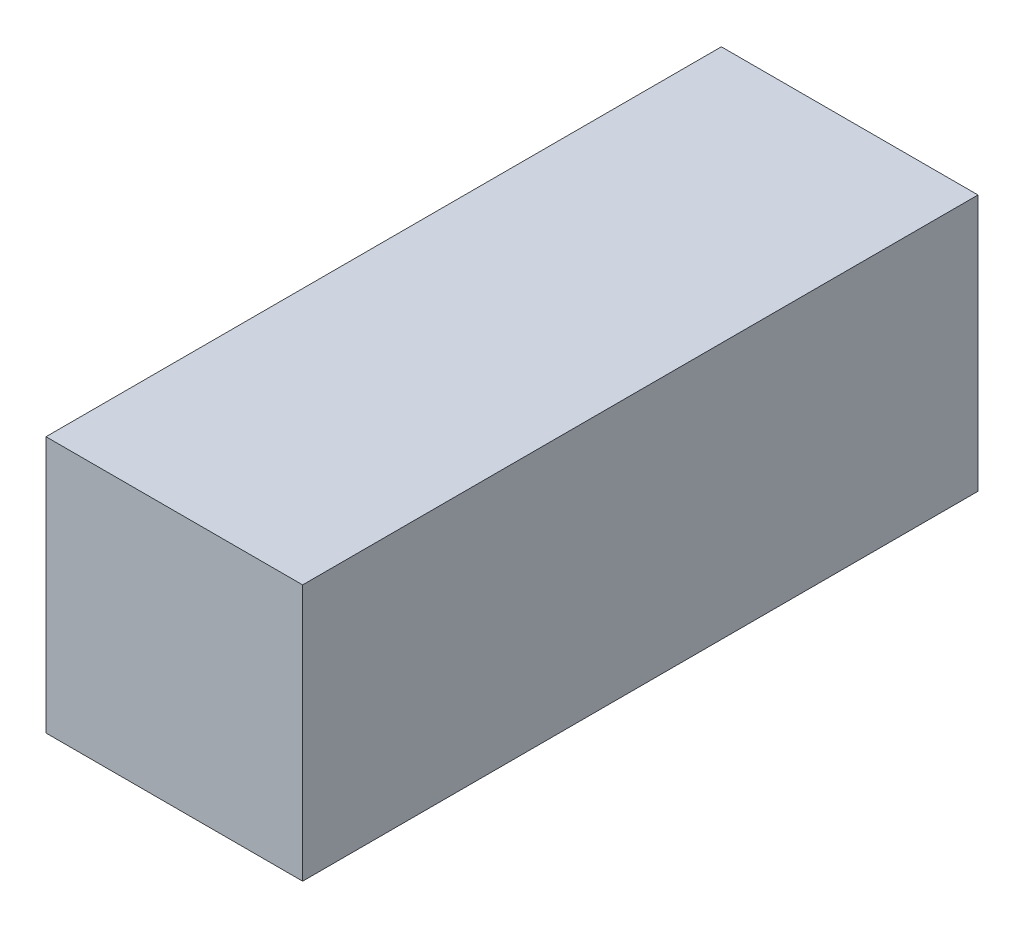
ISO-10303-21;
HEADER;
FILE_DESCRIPTION(('STEP AP214'),'2;1');
FILE_NAME('part.step','',(''),(''),'','','');
FILE_SCHEMA(('AUTOMOTIVE_DESIGN { 1 0 10303 214 1 1 1 1 }'));
ENDSEC;
DATA;
#1=APPLICATION_CONTEXT('core data for automotive mechanical design processes');
#2=APPLICATION_PROTOCOL_DEFINITION('international standard','automotive_design',2000,#1);
#3=PRODUCT_CONTEXT('',#1,'mechanical');
#4=PRODUCT('Part','Part','',(#3));
#5=PRODUCT_RELATED_PRODUCT_CATEGORY('part','',(#4));
#6=PRODUCT_DEFINITION_FORMATION('','',#4);
#7=PRODUCT_DEFINITION_CONTEXT('part definition',#1,'design');
#8=PRODUCT_DEFINITION('design','',#6,#7);
#9=PRODUCT_DEFINITION_SHAPE('','',#8);
#10=(LENGTH_UNIT() NAMED_UNIT(*) SI_UNIT(.MILLI.,.METRE.));
#11=(NAMED_UNIT(*) PLANE_ANGLE_UNIT() SI_UNIT($,.RADIAN.));
#12=(NAMED_UNIT(*) SI_UNIT($,.STERADIAN.) SOLID_ANGLE_UNIT());
#13=UNCERTAINTY_MEASURE_WITH_UNIT(LENGTH_MEASURE(1.E-05),#10,'distance_accuracy_value','');
#14=(GEOMETRIC_REPRESENTATION_CONTEXT(3) GLOBAL_UNCERTAINTY_ASSIGNED_CONTEXT((#13)) GLOBAL_UNIT_ASSIGNED_CONTEXT((#10,
#11,#12)) REPRESENTATION_CONTEXT('',''));
#15=CARTESIAN_POINT('',(0.,0.,0.));
#16=DIRECTION('',(0.,0.,1.));
#17=DIRECTION('',(1.,0.,0.));
#18=AXIS2_PLACEMENT_3D('',#15,#16,#17);
#19=CARTESIAN_POINT('',(-19.,19.,100.));
#20=DIRECTION('',(1.,0.,0.));
#21=DIRECTION('',(0.,0.,-1.));
#22=AXIS2_PLACEMENT_3D('',#19,#20,#21);
#23=PLANE('',#22);
#24=DIRECTION('',(0.,-1.,0.));
#25=VECTOR('',#24,1.);
#26=CARTESIAN_POINT('',(-19.,19.,0.));
#27=LINE('',#26,#25);
#28=CARTESIAN_POINT('',(-19.,19.,0.));
#29=VERTEX_POINT('',#28);
#30=CARTESIAN_POINT('',(-19.,-19.,0.));
#31=VERTEX_POINT('',#30);
#32=EDGE_CURVE('E96',#29,#31,#27,.T.);
#33=ORIENTED_EDGE('',*,*,#32,.T.);
#34=DIRECTION('',(0.,0.,-1.));
#35=VECTOR('',#34,1.);
#36=CARTESIAN_POINT('',(-19.,-19.,100.));
#37=LINE('',#36,#35);
#38=CARTESIAN_POINT('',(-19.,-19.,100.));
#39=VERTEX_POINT('',#38);
#40=EDGE_CURVE('E11',#39,#31,#37,.T.);
#41=ORIENTED_EDGE('',*,*,#40,.F.);
#42=DIRECTION('',(0.,-1.,0.));
#43=VECTOR('',#42,1.);
#44=CARTESIAN_POINT('',(-19.,19.,100.));
#45=LINE('',#44,#43);
#46=CARTESIAN_POINT('',(-19.,19.,100.));
#47=VERTEX_POINT('',#46);
#48=EDGE_CURVE('E84',#47,#39,#45,.T.);
#49=ORIENTED_EDGE('',*,*,#48,.F.);
#50=DIRECTION('',(0.,0.,-1.));
#51=VECTOR('',#50,1.);
#52=CARTESIAN_POINT('',(-19.,19.,100.));
#53=LINE('',#52,#51);
#54=EDGE_CURVE('E92',#47,#29,#53,.T.);
#55=ORIENTED_EDGE('',*,*,#54,.T.);
#56=EDGE_LOOP('',(#33,#41,#49,#55));
#57=FACE_BOUND('',#56,.T.);
#58=ADVANCED_FACE('F33',(#57),#23,.F.);
#59=CARTESIAN_POINT('',(19.,-19.,100.));
#60=DIRECTION('',(0.,1.,0.));
#61=DIRECTION('',(-1.,0.,0.));
#62=AXIS2_PLACEMENT_3D('',#59,#60,#61);
#63=PLANE('',#62);
#64=DIRECTION('',(1.,0.,0.));
#65=VECTOR('',#64,1.);
#66=CARTESIAN_POINT('',(19.,-19.,0.));
#67=LINE('',#66,#65);
#68=CARTESIAN_POINT('',(19.,-19.,0.));
#69=VERTEX_POINT('',#68);
#70=EDGE_CURVE('E88',#31,#69,#67,.T.);
#71=ORIENTED_EDGE('',*,*,#70,.T.);
#72=DIRECTION('',(0.,0.,-1.));
#73=VECTOR('',#72,1.);
#74=CARTESIAN_POINT('',(19.,-19.,100.));
#75=LINE('',#74,#73);
#76=CARTESIAN_POINT('',(19.,-19.,100.));
#77=VERTEX_POINT('',#76);
#78=EDGE_CURVE('E41',#77,#69,#75,.T.);
#79=ORIENTED_EDGE('',*,*,#78,.F.);
#80=DIRECTION('',(1.,0.,0.));
#81=VECTOR('',#80,1.);
#82=CARTESIAN_POINT('',(19.,-19.,100.));
#83=LINE('',#82,#81);
#84=EDGE_CURVE('E79',#39,#77,#83,.T.);
#85=ORIENTED_EDGE('',*,*,#84,.F.);
#86=ORIENTED_EDGE('',*,*,#40,.T.);
#87=EDGE_LOOP('',(#71,#79,#85,#86));
#88=FACE_BOUND('',#87,.T.);
#89=ADVANCED_FACE('F87',(#88),#63,.F.);
#90=CARTESIAN_POINT('',(19.,19.,100.));
#91=DIRECTION('',(-1.,0.,0.));
#92=DIRECTION('',(0.,0.,1.));
#93=AXIS2_PLACEMENT_3D('',#90,#91,#92);
#94=PLANE('',#93);
#95=DIRECTION('',(0.,1.,0.));
#96=VECTOR('',#95,1.);
#97=CARTESIAN_POINT('',(19.,19.,0.));
#98=LINE('',#97,#96);
#99=CARTESIAN_POINT('',(19.,19.,0.));
#100=VERTEX_POINT('',#99);
#101=EDGE_CURVE('E66',#69,#100,#98,.T.);
#102=ORIENTED_EDGE('',*,*,#101,.T.);
#103=DIRECTION('',(0.,0.,-1.));
#104=VECTOR('',#103,1.);
#105=CARTESIAN_POINT('',(19.,19.,100.));
#106=LINE('',#105,#104);
#107=CARTESIAN_POINT('',(19.,19.,100.));
#108=VERTEX_POINT('',#107);
#109=EDGE_CURVE('E89',#108,#100,#106,.T.);
#110=ORIENTED_EDGE('',*,*,#109,.F.);
#111=DIRECTION('',(0.,1.,0.));
#112=VECTOR('',#111,1.);
#113=CARTESIAN_POINT('',(19.,19.,100.));
#114=LINE('',#113,#112);
#115=EDGE_CURVE('E82',#77,#108,#114,.T.);
#116=ORIENTED_EDGE('',*,*,#115,.F.);
#117=ORIENTED_EDGE('',*,*,#78,.T.);
#118=EDGE_LOOP('',(#102,#110,#116,#117));
#119=FACE_BOUND('',#118,.T.);
#120=ADVANCED_FACE('F90',(#119),#94,.F.);
#121=CARTESIAN_POINT('',(19.,19.,100.));
#122=DIRECTION('',(0.,-1.,0.));
#123=DIRECTION('',(1.,0.,0.));
#124=AXIS2_PLACEMENT_3D('',#121,#122,#123);
#125=PLANE('',#124);
#126=DIRECTION('',(-1.,0.,0.));
#127=VECTOR('',#126,1.);
#128=CARTESIAN_POINT('',(19.,19.,0.));
#129=LINE('',#128,#127);
#130=EDGE_CURVE('E72',#100,#29,#129,.T.);
#131=ORIENTED_EDGE('',*,*,#130,.T.);
#132=ORIENTED_EDGE('',*,*,#54,.F.);
#133=DIRECTION('',(-1.,0.,0.));
#134=VECTOR('',#133,1.);
#135=CARTESIAN_POINT('',(19.,19.,100.));
#136=LINE('',#135,#134);
#137=EDGE_CURVE('E49',#108,#47,#136,.T.);
#138=ORIENTED_EDGE('',*,*,#137,.F.);
#139=ORIENTED_EDGE('',*,*,#109,.T.);
#140=EDGE_LOOP('',(#131,#132,#138,#139));
#141=FACE_BOUND('',#140,.T.);
#142=ADVANCED_FACE('F103',(#141),#125,.F.);
#143=CARTESIAN_POINT('',(0.,0.,100.));
#144=DIRECTION('',(0.,0.,-1.));
#145=DIRECTION('',(-1.,0.,0.));
#146=AXIS2_PLACEMENT_3D('',#143,#144,#145);
#147=PLANE('',#146);
#148=ORIENTED_EDGE('',*,*,#48,.T.);
#149=ORIENTED_EDGE('',*,*,#84,.T.);
#150=ORIENTED_EDGE('',*,*,#115,.T.);
#151=ORIENTED_EDGE('',*,*,#137,.T.);
#152=EDGE_LOOP('',(#148,#149,#150,#151));
#153=FACE_BOUND('',#152,.T.);
#154=ADVANCED_FACE('F80',(#153),#147,.F.);
#155=CARTESIAN_POINT('',(0.,0.,0.));
#156=DIRECTION('',(0.,0.,-1.));
#157=DIRECTION('',(-1.,0.,0.));
#158=AXIS2_PLACEMENT_3D('',#155,#156,#157);
#159=PLANE('',#158);
#160=ORIENTED_EDGE('',*,*,#32,.F.);
#161=ORIENTED_EDGE('',*,*,#130,.F.);
#162=ORIENTED_EDGE('',*,*,#101,.F.);
#163=ORIENTED_EDGE('',*,*,#70,.F.);
#164=EDGE_LOOP('',(#160,#161,#162,#163));
#165=FACE_BOUND('',#164,.T.);
#166=ADVANCED_FACE('F106',(#165),#159,.T.);
#167=CLOSED_SHELL('',(#58,#89,#120,#142,#154,#166));
#168=MANIFOLD_SOLID_BREP('B2',#167);
#169=ADVANCED_BREP_SHAPE_REPRESENTATION('',(#18,#168),#14);
#170=SHAPE_DEFINITION_REPRESENTATION(#9,#169);
ENDSEC;
END-ISO-10303-21;
